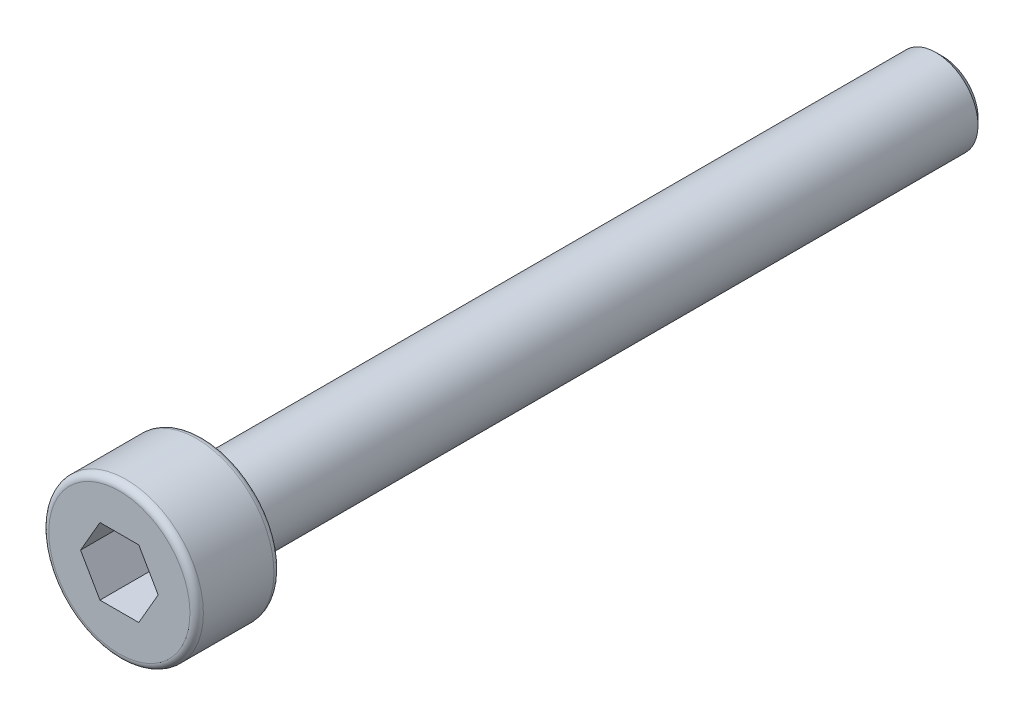
ISO-10303-21;
HEADER;
FILE_DESCRIPTION(('STEP AP214'),'2;1');
FILE_NAME('part.step','',(''),(''),'','','');
FILE_SCHEMA(('AUTOMOTIVE_DESIGN { 1 0 10303 214 1 1 1 1 }'));
ENDSEC;
DATA;
#1=APPLICATION_CONTEXT('core data for automotive mechanical design processes');
#2=APPLICATION_PROTOCOL_DEFINITION('international standard','automotive_design',2000,#1);
#3=PRODUCT_CONTEXT('',#1,'mechanical');
#4=PRODUCT('Part','Part','',(#3));
#5=PRODUCT_RELATED_PRODUCT_CATEGORY('part','',(#4));
#6=PRODUCT_DEFINITION_FORMATION('','',#4);
#7=PRODUCT_DEFINITION_CONTEXT('part definition',#1,'design');
#8=PRODUCT_DEFINITION('design','',#6,#7);
#9=PRODUCT_DEFINITION_SHAPE('','',#8);
#10=(LENGTH_UNIT() NAMED_UNIT(*) SI_UNIT(.MILLI.,.METRE.));
#11=(NAMED_UNIT(*) PLANE_ANGLE_UNIT() SI_UNIT($,.RADIAN.));
#12=(NAMED_UNIT(*) SI_UNIT($,.STERADIAN.) SOLID_ANGLE_UNIT());
#13=UNCERTAINTY_MEASURE_WITH_UNIT(LENGTH_MEASURE(1.E-05),#10,'distance_accuracy_value','');
#14=(GEOMETRIC_REPRESENTATION_CONTEXT(3) GLOBAL_UNCERTAINTY_ASSIGNED_CONTEXT((#13)) GLOBAL_UNIT_ASSIGNED_CONTEXT((#10,
#11,#12)) REPRESENTATION_CONTEXT('',''));
#15=CARTESIAN_POINT('',(0.,0.,0.));
#16=DIRECTION('',(0.,0.,1.));
#17=DIRECTION('',(1.,0.,0.));
#18=AXIS2_PLACEMENT_3D('',#15,#16,#17);
#19=CARTESIAN_POINT('',(0.,0.,0.));
#20=DIRECTION('',(0.,0.,1.));
#21=DIRECTION('',(0.,-1.,0.));
#22=AXIS2_PLACEMENT_3D('',#19,#20,#21);
#23=PLANE('',#22);
#24=DIRECTION('',(0.5,0.866025403784439,0.));
#25=VECTOR('',#24,1.);
#26=CARTESIAN_POINT('',(0.577350269189626,-1.,0.));
#27=LINE('',#26,#25);
#28=CARTESIAN_POINT('',(0.577350269189626,-1.,0.));
#29=VERTEX_POINT('',#28);
#30=CARTESIAN_POINT('',(1.15470053837925,0.,0.));
#31=VERTEX_POINT('',#30);
#32=EDGE_CURVE('E53',#29,#31,#27,.T.);
#33=ORIENTED_EDGE('',*,*,#32,.F.);
#34=DIRECTION('',(1.,0.,0.));
#35=VECTOR('',#34,1.);
#36=CARTESIAN_POINT('',(-0.577350269189626,-1.,0.));
#37=LINE('',#36,#35);
#38=CARTESIAN_POINT('',(-0.577350269189626,-1.,0.));
#39=VERTEX_POINT('',#38);
#40=EDGE_CURVE('E136',#39,#29,#37,.T.);
#41=ORIENTED_EDGE('',*,*,#40,.F.);
#42=DIRECTION('',(0.5,-0.866025403784438,0.));
#43=VECTOR('',#42,1.);
#44=CARTESIAN_POINT('',(-1.15470053837925,0.,0.));
#45=LINE('',#44,#43);
#46=CARTESIAN_POINT('',(-1.15470053837925,0.,0.));
#47=VERTEX_POINT('',#46);
#48=EDGE_CURVE('E134',#47,#39,#45,.T.);
#49=ORIENTED_EDGE('',*,*,#48,.F.);
#50=DIRECTION('',(-0.5,-0.866025403784439,0.));
#51=VECTOR('',#50,1.);
#52=CARTESIAN_POINT('',(-0.577350269189626,1.,0.));
#53=LINE('',#52,#51);
#54=CARTESIAN_POINT('',(-0.577350269189626,1.,0.));
#55=VERTEX_POINT('',#54);
#56=EDGE_CURVE('E101',#55,#47,#53,.T.);
#57=ORIENTED_EDGE('',*,*,#56,.F.);
#58=DIRECTION('',(-1.,0.,0.));
#59=VECTOR('',#58,1.);
#60=CARTESIAN_POINT('',(0.577350269189625,1.,0.));
#61=LINE('',#60,#59);
#62=CARTESIAN_POINT('',(0.577350269189625,1.,0.));
#63=VERTEX_POINT('',#62);
#64=EDGE_CURVE('E130',#63,#55,#61,.T.);
#65=ORIENTED_EDGE('',*,*,#64,.F.);
#66=DIRECTION('',(-0.5,0.866025403784438,0.));
#67=VECTOR('',#66,1.);
#68=CARTESIAN_POINT('',(1.15470053837925,0.,0.));
#69=LINE('',#68,#67);
#70=EDGE_CURVE('E127',#31,#63,#69,.T.);
#71=ORIENTED_EDGE('',*,*,#70,.F.);
#72=EDGE_LOOP('',(#33,#41,#49,#57,#65,#71));
#73=FACE_BOUND('',#72,.T.);
#74=CARTESIAN_POINT('',(0.,0.,0.));
#75=DIRECTION('',(0.,0.,1.));
#76=DIRECTION('',(0.,-1.,0.));
#77=AXIS2_PLACEMENT_3D('',#74,#75,#76);
#78=CIRCLE('',#77,2.1);
#79=CARTESIAN_POINT('',(0.,-2.1,0.));
#80=VERTEX_POINT('',#79);
#81=EDGE_CURVE('E157',#80,#80,#78,.T.);
#82=ORIENTED_EDGE('',*,*,#81,.T.);
#83=EDGE_LOOP('',(#82));
#84=FACE_BOUND('',#83,.T.);
#85=ADVANCED_FACE('F37',(#73,#84),#23,.T.);
#86=CARTESIAN_POINT('',(0.,0.,-24.5));
#87=DIRECTION('',(0.,0.,-1.));
#88=DIRECTION('',(0.,1.,0.));
#89=AXIS2_PLACEMENT_3D('',#86,#87,#88);
#90=CYLINDRICAL_SURFACE('',#89,2.3);
#91=CARTESIAN_POINT('',(0.,0.,-2.3));
#92=DIRECTION('',(0.,0.,-1.));
#93=DIRECTION('',(0.,1.,0.));
#94=AXIS2_PLACEMENT_3D('',#91,#92,#93);
#95=CIRCLE('',#94,2.3);
#96=CARTESIAN_POINT('',(0.,2.3,-2.3));
#97=VERTEX_POINT('',#96);
#98=EDGE_CURVE('E154',#97,#97,#95,.F.);
#99=ORIENTED_EDGE('',*,*,#98,.T.);
#100=EDGE_LOOP('',(#99));
#101=FACE_BOUND('',#100,.T.);
#102=CARTESIAN_POINT('',(0.,0.,-0.199999999999999));
#103=DIRECTION('',(0.,0.,1.));
#104=DIRECTION('',(0.,-1.,0.));
#105=AXIS2_PLACEMENT_3D('',#102,#103,#104);
#106=CIRCLE('',#105,2.3);
#107=CARTESIAN_POINT('',(0.,-2.3,-0.199999999999999));
#108=VERTEX_POINT('',#107);
#109=EDGE_CURVE('E151',#108,#108,#106,.F.);
#110=ORIENTED_EDGE('',*,*,#109,.T.);
#111=EDGE_LOOP('',(#110));
#112=FACE_BOUND('',#111,.T.);
#113=ADVANCED_FACE('F178',(#101,#112),#90,.T.);
#114=CARTESIAN_POINT('',(0.,2.3,-2.5));
#115=DIRECTION('',(0.,0.,-1.));
#116=DIRECTION('',(0.,1.,0.));
#117=AXIS2_PLACEMENT_3D('',#114,#115,#116);
#118=PLANE('',#117);
#119=CARTESIAN_POINT('',(0.,0.,-2.5));
#120=DIRECTION('',(0.,0.,-1.));
#121=DIRECTION('',(0.,1.,0.));
#122=AXIS2_PLACEMENT_3D('',#119,#120,#121);
#123=CIRCLE('',#122,2.1);
#124=CARTESIAN_POINT('',(0.,2.1,-2.5));
#125=VERTEX_POINT('',#124);
#126=EDGE_CURVE('E148',#125,#125,#123,.T.);
#127=ORIENTED_EDGE('',*,*,#126,.T.);
#128=EDGE_LOOP('',(#127));
#129=FACE_BOUND('',#128,.T.);
#130=CARTESIAN_POINT('',(0.,0.,-2.5));
#131=DIRECTION('',(0.,0.,-1.));
#132=DIRECTION('',(0.,1.,0.));
#133=AXIS2_PLACEMENT_3D('',#130,#131,#132);
#134=CIRCLE('',#133,1.25);
#135=CARTESIAN_POINT('',(0.,1.25,-2.5));
#136=VERTEX_POINT('',#135);
#137=EDGE_CURVE('E140',#136,#136,#134,.T.);
#138=ORIENTED_EDGE('',*,*,#137,.F.);
#139=EDGE_LOOP('',(#138));
#140=FACE_BOUND('',#139,.T.);
#141=ADVANCED_FACE('F184',(#129,#140),#118,.T.);
#142=CARTESIAN_POINT('',(0.,0.,-24.5));
#143=DIRECTION('',(0.,0.,-1.));
#144=DIRECTION('',(0.,1.,0.));
#145=AXIS2_PLACEMENT_3D('',#142,#143,#144);
#146=CYLINDRICAL_SURFACE('',#145,1.25);
#147=CARTESIAN_POINT('',(0.,0.,-24.3));
#148=DIRECTION('',(0.,0.,-1.));
#149=DIRECTION('',(0.,1.,0.));
#150=AXIS2_PLACEMENT_3D('',#147,#148,#149);
#151=CIRCLE('',#150,1.25);
#152=CARTESIAN_POINT('',(0.,1.25,-24.3));
#153=VERTEX_POINT('',#152);
#154=EDGE_CURVE('E11',#153,#153,#151,.F.);
#155=ORIENTED_EDGE('',*,*,#154,.T.);
#156=EDGE_LOOP('',(#155));
#157=FACE_BOUND('',#156,.T.);
#158=ORIENTED_EDGE('',*,*,#137,.T.);
#159=EDGE_LOOP('',(#158));
#160=FACE_BOUND('',#159,.T.);
#161=ADVANCED_FACE('F195',(#157,#160),#146,.T.);
#162=CARTESIAN_POINT('',(0.,1.25,-24.5));
#163=DIRECTION('',(0.,0.,-1.));
#164=DIRECTION('',(0.,1.,0.));
#165=AXIS2_PLACEMENT_3D('',#162,#163,#164);
#166=PLANE('',#165);
#167=CARTESIAN_POINT('',(0.,0.,-24.5));
#168=DIRECTION('',(0.,0.,-1.));
#169=DIRECTION('',(0.,1.,0.));
#170=AXIS2_PLACEMENT_3D('',#167,#168,#169);
#171=CIRCLE('',#170,1.05000000000001);
#172=CARTESIAN_POINT('',(0.,1.05000000000001,-24.5));
#173=VERTEX_POINT('',#172);
#174=EDGE_CURVE('E46',#173,#173,#171,.T.);
#175=ORIENTED_EDGE('',*,*,#174,.T.);
#176=EDGE_LOOP('',(#175));
#177=FACE_BOUND('',#176,.T.);
#178=ADVANCED_FACE('F162',(#177),#166,.T.);
#179=CARTESIAN_POINT('',(0.,0.,-2.3));
#180=DIRECTION('',(0.,0.,-1.));
#181=DIRECTION('',(0.,1.,0.));
#182=AXIS2_PLACEMENT_3D('',#179,#180,#181);
#183=TOROIDAL_SURFACE('',#182,2.1,0.2);
#184=ORIENTED_EDGE('',*,*,#98,.F.);
#185=EDGE_LOOP('',(#184));
#186=FACE_BOUND('',#185,.T.);
#187=ORIENTED_EDGE('',*,*,#126,.F.);
#188=EDGE_LOOP('',(#187));
#189=FACE_BOUND('',#188,.T.);
#190=ADVANCED_FACE('F174',(#186,#189),#183,.T.);
#191=CARTESIAN_POINT('',(0.,0.,-0.199999999999999));
#192=DIRECTION('',(0.,0.,1.));
#193=DIRECTION('',(0.,-1.,0.));
#194=AXIS2_PLACEMENT_3D('',#191,#192,#193);
#195=TOROIDAL_SURFACE('',#194,2.1,0.2);
#196=ORIENTED_EDGE('',*,*,#81,.F.);
#197=EDGE_LOOP('',(#196));
#198=FACE_BOUND('',#197,.T.);
#199=ORIENTED_EDGE('',*,*,#109,.F.);
#200=EDGE_LOOP('',(#199));
#201=FACE_BOUND('',#200,.T.);
#202=ADVANCED_FACE('F166',(#198,#201),#195,.T.);
#203=CARTESIAN_POINT('',(0.,0.,-24.5));
#204=DIRECTION('',(0.,0.,1.));
#205=DIRECTION('',(0.,-1.,0.));
#206=AXIS2_PLACEMENT_3D('',#203,#204,#205);
#207=CONICAL_SURFACE('',#206,1.05000000000001,0.785398163397441);
#208=ORIENTED_EDGE('',*,*,#154,.F.);
#209=EDGE_LOOP('',(#208));
#210=FACE_BOUND('',#209,.T.);
#211=ORIENTED_EDGE('',*,*,#174,.F.);
#212=EDGE_LOOP('',(#211));
#213=FACE_BOUND('',#212,.T.);
#214=ADVANCED_FACE('F40',(#210,#213),#207,.T.);
#215=CARTESIAN_POINT('',(0.577350269189626,-1.,-1.5));
#216=DIRECTION('',(0.866025403784439,-0.5,0.));
#217=DIRECTION('',(0.5,0.866025403784439,0.));
#218=AXIS2_PLACEMENT_3D('',#215,#216,#217);
#219=PLANE('',#218);
#220=ORIENTED_EDGE('',*,*,#32,.T.);
#221=DIRECTION('',(0.,0.,1.));
#222=VECTOR('',#221,1.);
#223=CARTESIAN_POINT('',(1.15470053837925,0.,-1.5));
#224=LINE('',#223,#222);
#225=CARTESIAN_POINT('',(1.15470053837925,0.,-1.5));
#226=VERTEX_POINT('',#225);
#227=EDGE_CURVE('E83',#226,#31,#224,.T.);
#228=ORIENTED_EDGE('',*,*,#227,.F.);
#229=DIRECTION('',(0.5,0.866025403784439,0.));
#230=VECTOR('',#229,1.);
#231=CARTESIAN_POINT('',(0.577350269189626,-1.,-1.5));
#232=LINE('',#231,#230);
#233=CARTESIAN_POINT('',(0.577350269189626,-1.,-1.5));
#234=VERTEX_POINT('',#233);
#235=EDGE_CURVE('E138',#234,#226,#232,.T.);
#236=ORIENTED_EDGE('',*,*,#235,.F.);
#237=DIRECTION('',(0.,0.,1.));
#238=VECTOR('',#237,1.);
#239=CARTESIAN_POINT('',(0.577350269189626,-1.,-1.5));
#240=LINE('',#239,#238);
#241=EDGE_CURVE('E61',#234,#29,#240,.T.);
#242=ORIENTED_EDGE('',*,*,#241,.T.);
#243=EDGE_LOOP('',(#220,#228,#236,#242));
#244=FACE_BOUND('',#243,.T.);
#245=ADVANCED_FACE('F165',(#244),#219,.F.);
#246=CARTESIAN_POINT('',(-0.577350269189626,-1.,-1.5));
#247=DIRECTION('',(0.,-1.,0.));
#248=DIRECTION('',(0.,0.,-1.));
#249=AXIS2_PLACEMENT_3D('',#246,#247,#248);
#250=PLANE('',#249);
#251=ORIENTED_EDGE('',*,*,#40,.T.);
#252=ORIENTED_EDGE('',*,*,#241,.F.);
#253=DIRECTION('',(1.,0.,0.));
#254=VECTOR('',#253,1.);
#255=CARTESIAN_POINT('',(-0.577350269189626,-1.,-1.5));
#256=LINE('',#255,#254);
#257=CARTESIAN_POINT('',(-0.577350269189626,-1.,-1.5));
#258=VERTEX_POINT('',#257);
#259=EDGE_CURVE('E113',#258,#234,#256,.T.);
#260=ORIENTED_EDGE('',*,*,#259,.F.);
#261=DIRECTION('',(0.,0.,1.));
#262=VECTOR('',#261,1.);
#263=CARTESIAN_POINT('',(-0.577350269189626,-1.,-1.5));
#264=LINE('',#263,#262);
#265=EDGE_CURVE('E105',#258,#39,#264,.T.);
#266=ORIENTED_EDGE('',*,*,#265,.T.);
#267=EDGE_LOOP('',(#251,#252,#260,#266));
#268=FACE_BOUND('',#267,.T.);
#269=ADVANCED_FACE('F172',(#268),#250,.F.);
#270=CARTESIAN_POINT('',(-1.15470053837925,0.,-1.5));
#271=DIRECTION('',(-0.866025403784438,-0.5,0.));
#272=DIRECTION('',(0.5,-0.866025403784438,0.));
#273=AXIS2_PLACEMENT_3D('',#270,#271,#272);
#274=PLANE('',#273);
#275=ORIENTED_EDGE('',*,*,#48,.T.);
#276=ORIENTED_EDGE('',*,*,#265,.F.);
#277=DIRECTION('',(0.5,-0.866025403784438,0.));
#278=VECTOR('',#277,1.);
#279=CARTESIAN_POINT('',(-1.15470053837925,0.,-1.5));
#280=LINE('',#279,#278);
#281=CARTESIAN_POINT('',(-1.15470053837925,0.,-1.5));
#282=VERTEX_POINT('',#281);
#283=EDGE_CURVE('E109',#282,#258,#280,.T.);
#284=ORIENTED_EDGE('',*,*,#283,.F.);
#285=DIRECTION('',(0.,0.,1.));
#286=VECTOR('',#285,1.);
#287=CARTESIAN_POINT('',(-1.15470053837925,0.,-1.5));
#288=LINE('',#287,#286);
#289=EDGE_CURVE('E94',#282,#47,#288,.T.);
#290=ORIENTED_EDGE('',*,*,#289,.T.);
#291=EDGE_LOOP('',(#275,#276,#284,#290));
#292=FACE_BOUND('',#291,.T.);
#293=ADVANCED_FACE('F110',(#292),#274,.F.);
#294=CARTESIAN_POINT('',(-0.577350269189626,1.,-1.5));
#295=DIRECTION('',(-0.866025403784439,0.5,0.));
#296=DIRECTION('',(-0.5,-0.866025403784439,0.));
#297=AXIS2_PLACEMENT_3D('',#294,#295,#296);
#298=PLANE('',#297);
#299=ORIENTED_EDGE('',*,*,#56,.T.);
#300=ORIENTED_EDGE('',*,*,#289,.F.);
#301=DIRECTION('',(-0.5,-0.866025403784439,0.));
#302=VECTOR('',#301,1.);
#303=CARTESIAN_POINT('',(-0.577350269189626,1.,-1.5));
#304=LINE('',#303,#302);
#305=CARTESIAN_POINT('',(-0.577350269189626,1.,-1.5));
#306=VERTEX_POINT('',#305);
#307=EDGE_CURVE('E98',#306,#282,#304,.T.);
#308=ORIENTED_EDGE('',*,*,#307,.F.);
#309=DIRECTION('',(0.,0.,1.));
#310=VECTOR('',#309,1.);
#311=CARTESIAN_POINT('',(-0.577350269189626,1.,-1.5));
#312=LINE('',#311,#310);
#313=EDGE_CURVE('E106',#306,#55,#312,.T.);
#314=ORIENTED_EDGE('',*,*,#313,.T.);
#315=EDGE_LOOP('',(#299,#300,#308,#314));
#316=FACE_BOUND('',#315,.T.);
#317=ADVANCED_FACE('F96',(#316),#298,.F.);
#318=CARTESIAN_POINT('',(0.577350269189625,1.,-1.5));
#319=DIRECTION('',(0.,1.,0.));
#320=DIRECTION('',(0.,0.,1.));
#321=AXIS2_PLACEMENT_3D('',#318,#319,#320);
#322=PLANE('',#321);
#323=ORIENTED_EDGE('',*,*,#64,.T.);
#324=ORIENTED_EDGE('',*,*,#313,.F.);
#325=DIRECTION('',(-1.,0.,0.));
#326=VECTOR('',#325,1.);
#327=CARTESIAN_POINT('',(0.577350269189625,1.,-1.5));
#328=LINE('',#327,#326);
#329=CARTESIAN_POINT('',(0.577350269189625,1.,-1.5));
#330=VERTEX_POINT('',#329);
#331=EDGE_CURVE('E119',#330,#306,#328,.T.);
#332=ORIENTED_EDGE('',*,*,#331,.F.);
#333=DIRECTION('',(0.,0.,1.));
#334=VECTOR('',#333,1.);
#335=CARTESIAN_POINT('',(0.577350269189625,1.,-1.5));
#336=LINE('',#335,#334);
#337=EDGE_CURVE('E143',#330,#63,#336,.T.);
#338=ORIENTED_EDGE('',*,*,#337,.T.);
#339=EDGE_LOOP('',(#323,#324,#332,#338));
#340=FACE_BOUND('',#339,.T.);
#341=ADVANCED_FACE('F214',(#340),#322,.F.);
#342=CARTESIAN_POINT('',(1.15470053837925,0.,-1.5));
#343=DIRECTION('',(0.866025403784439,0.5,0.));
#344=DIRECTION('',(-0.5,0.866025403784439,0.));
#345=AXIS2_PLACEMENT_3D('',#342,#343,#344);
#346=PLANE('',#345);
#347=ORIENTED_EDGE('',*,*,#70,.T.);
#348=ORIENTED_EDGE('',*,*,#337,.F.);
#349=DIRECTION('',(-0.5,0.866025403784438,0.));
#350=VECTOR('',#349,1.);
#351=CARTESIAN_POINT('',(1.15470053837925,0.,-1.5));
#352=LINE('',#351,#350);
#353=EDGE_CURVE('E121',#226,#330,#352,.T.);
#354=ORIENTED_EDGE('',*,*,#353,.F.);
#355=ORIENTED_EDGE('',*,*,#227,.T.);
#356=EDGE_LOOP('',(#347,#348,#354,#355));
#357=FACE_BOUND('',#356,.T.);
#358=ADVANCED_FACE('F211',(#357),#346,.F.);
#359=CARTESIAN_POINT('',(0.,0.,-1.5));
#360=DIRECTION('',(0.,0.,1.));
#361=DIRECTION('',(1.,0.,0.));
#362=AXIS2_PLACEMENT_3D('',#359,#360,#361);
#363=PLANE('',#362);
#364=ORIENTED_EDGE('',*,*,#235,.T.);
#365=ORIENTED_EDGE('',*,*,#353,.T.);
#366=ORIENTED_EDGE('',*,*,#331,.T.);
#367=ORIENTED_EDGE('',*,*,#307,.T.);
#368=ORIENTED_EDGE('',*,*,#283,.T.);
#369=ORIENTED_EDGE('',*,*,#259,.T.);
#370=EDGE_LOOP('',(#364,#365,#366,#367,#368,#369));
#371=FACE_BOUND('',#370,.T.);
#372=ADVANCED_FACE('F116',(#371),#363,.T.);
#373=CLOSED_SHELL('',(#85,#113,#141,#161,#178,#190,#202,#214,#245,#269,#293,#317,#341,#358,#372));
#374=MANIFOLD_SOLID_BREP('B2',#373);
#375=ADVANCED_BREP_SHAPE_REPRESENTATION('',(#18,#374),#14);
#376=SHAPE_DEFINITION_REPRESENTATION(#9,#375);
ENDSEC;
END-ISO-10303-21;
